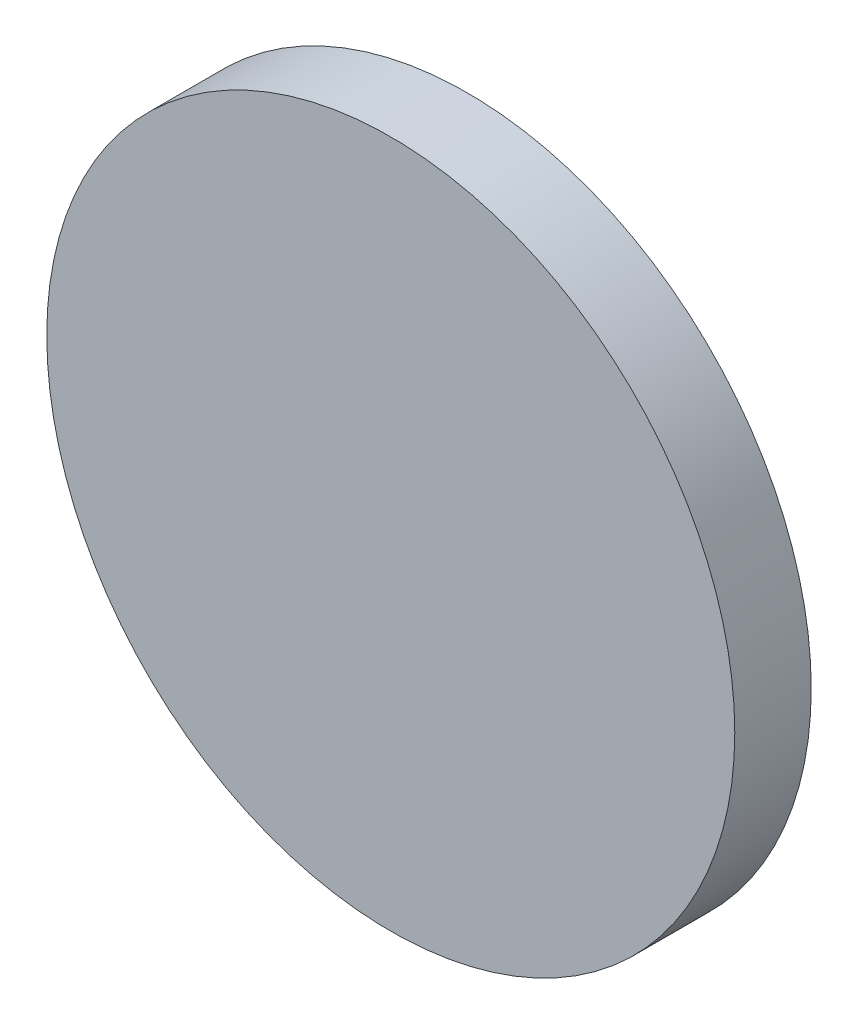
ISO-10303-21;
HEADER;
FILE_DESCRIPTION(('STEP AP214'),'2;1');
FILE_NAME('part.step','',(''),(''),'','','');
FILE_SCHEMA(('AUTOMOTIVE_DESIGN { 1 0 10303 214 1 1 1 1 }'));
ENDSEC;
DATA;
#1=APPLICATION_CONTEXT('core data for automotive mechanical design processes');
#2=APPLICATION_PROTOCOL_DEFINITION('international standard','automotive_design',2000,#1);
#3=PRODUCT_CONTEXT('',#1,'mechanical');
#4=PRODUCT('Part','Part','',(#3));
#5=PRODUCT_RELATED_PRODUCT_CATEGORY('part','',(#4));
#6=PRODUCT_DEFINITION_FORMATION('','',#4);
#7=PRODUCT_DEFINITION_CONTEXT('part definition',#1,'design');
#8=PRODUCT_DEFINITION('design','',#6,#7);
#9=PRODUCT_DEFINITION_SHAPE('','',#8);
#10=(LENGTH_UNIT() NAMED_UNIT(*) SI_UNIT(.MILLI.,.METRE.));
#11=(NAMED_UNIT(*) PLANE_ANGLE_UNIT() SI_UNIT($,.RADIAN.));
#12=(NAMED_UNIT(*) SI_UNIT($,.STERADIAN.) SOLID_ANGLE_UNIT());
#13=UNCERTAINTY_MEASURE_WITH_UNIT(LENGTH_MEASURE(1.E-05),#10,'distance_accuracy_value','');
#14=(GEOMETRIC_REPRESENTATION_CONTEXT(3) GLOBAL_UNCERTAINTY_ASSIGNED_CONTEXT((#13)) GLOBAL_UNIT_ASSIGNED_CONTEXT((#10,
#11,#12)) REPRESENTATION_CONTEXT('',''));
#15=CARTESIAN_POINT('',(0.,0.,0.));
#16=DIRECTION('',(0.,0.,1.));
#17=DIRECTION('',(1.,0.,0.));
#18=AXIS2_PLACEMENT_3D('',#15,#16,#17);
#19=CARTESIAN_POINT('',(0.,0.,5.));
#20=DIRECTION('',(0.,0.,-1.));
#21=DIRECTION('',(-1.,0.,0.));
#22=AXIS2_PLACEMENT_3D('',#19,#20,#21);
#23=CYLINDRICAL_SURFACE('',#22,22.5);
#24=CARTESIAN_POINT('',(0.,0.,5.));
#25=DIRECTION('',(0.,0.,1.));
#26=DIRECTION('',(1.,0.,0.));
#27=AXIS2_PLACEMENT_3D('',#24,#25,#26);
#28=CIRCLE('',#27,22.5);
#29=CARTESIAN_POINT('',(22.5,0.,5.));
#30=VERTEX_POINT('',#29);
#31=EDGE_CURVE('E10',#30,#30,#28,.T.);
#32=ORIENTED_EDGE('',*,*,#31,.F.);
#33=EDGE_LOOP('',(#32));
#34=FACE_BOUND('',#33,.T.);
#35=CARTESIAN_POINT('',(0.,0.,0.));
#36=DIRECTION('',(0.,0.,1.));
#37=DIRECTION('',(1.,0.,0.));
#38=AXIS2_PLACEMENT_3D('',#35,#36,#37);
#39=CIRCLE('',#38,22.5);
#40=CARTESIAN_POINT('',(22.5,0.,0.));
#41=VERTEX_POINT('',#40);
#42=EDGE_CURVE('E34',#41,#41,#39,.T.);
#43=ORIENTED_EDGE('',*,*,#42,.T.);
#44=EDGE_LOOP('',(#43));
#45=FACE_BOUND('',#44,.T.);
#46=ADVANCED_FACE('F31',(#34,#45),#23,.T.);
#47=CARTESIAN_POINT('',(0.,0.,5.));
#48=DIRECTION('',(0.,0.,1.));
#49=DIRECTION('',(1.,0.,0.));
#50=AXIS2_PLACEMENT_3D('',#47,#48,#49);
#51=PLANE('',#50);
#52=ORIENTED_EDGE('',*,*,#31,.T.);
#53=EDGE_LOOP('',(#52));
#54=FACE_BOUND('',#53,.T.);
#55=ADVANCED_FACE('F46',(#54),#51,.T.);
#56=CARTESIAN_POINT('',(0.,0.,0.));
#57=DIRECTION('',(0.,0.,1.));
#58=DIRECTION('',(1.,0.,0.));
#59=AXIS2_PLACEMENT_3D('',#56,#57,#58);
#60=PLANE('',#59);
#61=ORIENTED_EDGE('',*,*,#42,.F.);
#62=EDGE_LOOP('',(#61));
#63=FACE_BOUND('',#62,.T.);
#64=ADVANCED_FACE('F44',(#63),#60,.F.);
#65=CLOSED_SHELL('',(#46,#55,#64));
#66=MANIFOLD_SOLID_BREP('B2',#65);
#67=ADVANCED_BREP_SHAPE_REPRESENTATION('',(#18,#66),#14);
#68=SHAPE_DEFINITION_REPRESENTATION(#9,#67);
ENDSEC;
END-ISO-10303-21;
